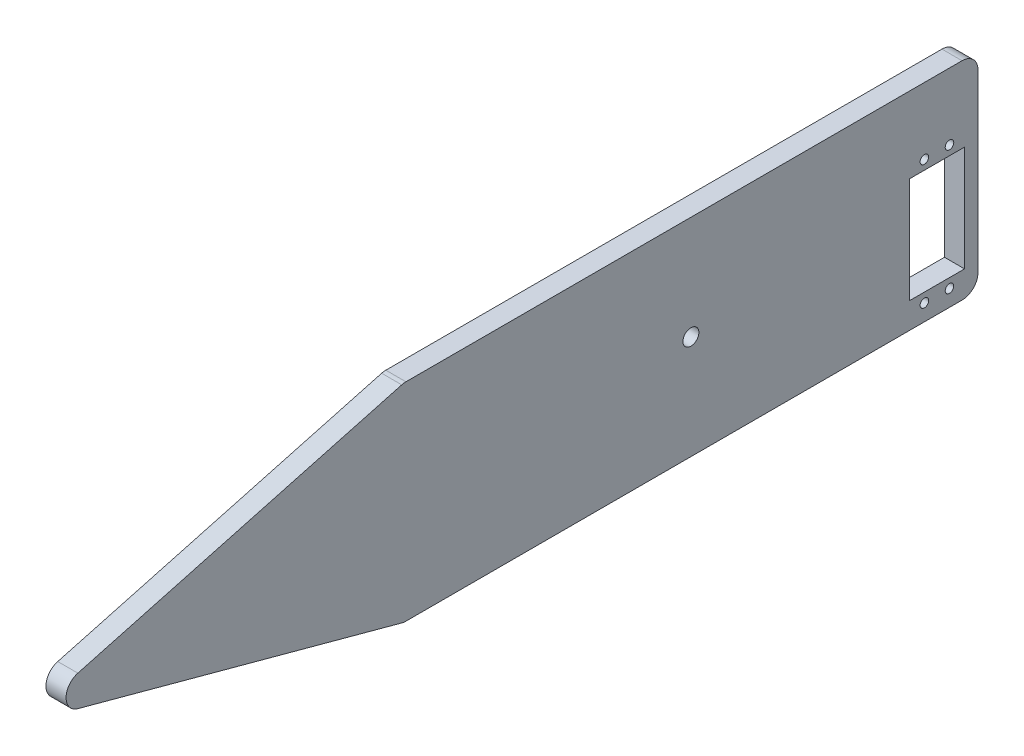
ISO-10303-21;
HEADER;
FILE_DESCRIPTION(('STEP AP214'),'2;1');
FILE_NAME('part.step','',(''),(''),'','','');
FILE_SCHEMA(('AUTOMOTIVE_DESIGN { 1 0 10303 214 1 1 1 1 }'));
ENDSEC;
DATA;
#1=APPLICATION_CONTEXT('core data for automotive mechanical design processes');
#2=APPLICATION_PROTOCOL_DEFINITION('international standard','automotive_design',2000,#1);
#3=PRODUCT_CONTEXT('',#1,'mechanical');
#4=PRODUCT('Part','Part','',(#3));
#5=PRODUCT_RELATED_PRODUCT_CATEGORY('part','',(#4));
#6=PRODUCT_DEFINITION_FORMATION('','',#4);
#7=PRODUCT_DEFINITION_CONTEXT('part definition',#1,'design');
#8=PRODUCT_DEFINITION('design','',#6,#7);
#9=PRODUCT_DEFINITION_SHAPE('','',#8);
#10=(LENGTH_UNIT() NAMED_UNIT(*) SI_UNIT(.MILLI.,.METRE.));
#11=(NAMED_UNIT(*) PLANE_ANGLE_UNIT() SI_UNIT($,.RADIAN.));
#12=(NAMED_UNIT(*) SI_UNIT($,.STERADIAN.) SOLID_ANGLE_UNIT());
#13=UNCERTAINTY_MEASURE_WITH_UNIT(LENGTH_MEASURE(1.E-05),#10,'distance_accuracy_value','');
#14=(GEOMETRIC_REPRESENTATION_CONTEXT(3) GLOBAL_UNCERTAINTY_ASSIGNED_CONTEXT((#13)) GLOBAL_UNIT_ASSIGNED_CONTEXT((#10,
#11,#12)) REPRESENTATION_CONTEXT('',''));
#15=CARTESIAN_POINT('',(0.,0.,0.));
#16=DIRECTION('',(0.,0.,1.));
#17=DIRECTION('',(1.,0.,0.));
#18=AXIS2_PLACEMENT_3D('',#15,#16,#17);
#19=CARTESIAN_POINT('',(4.0005,0.,0.));
#20=DIRECTION('',(1.,0.,0.));
#21=DIRECTION('',(0.,0.,-1.));
#22=AXIS2_PLACEMENT_3D('',#19,#20,#21);
#23=PLANE('',#22);
#24=DIRECTION('',(0.,1.,0.));
#25=VECTOR('',#24,1.);
#26=CARTESIAN_POINT('',(4.0005,-31.,-108.95));
#27=LINE('',#26,#25);
#28=CARTESIAN_POINT('',(4.0005,-31.,-108.95));
#29=VERTEX_POINT('',#28);
#30=CARTESIAN_POINT('',(4.0005,11.,-108.95));
#31=VERTEX_POINT('',#30);
#32=EDGE_CURVE('E53',#29,#31,#27,.T.);
#33=ORIENTED_EDGE('',*,*,#32,.F.);
#34=DIRECTION('',(0.,0.,-1.));
#35=VECTOR('',#34,1.);
#36=CARTESIAN_POINT('',(4.0005,-31.,-86.95));
#37=LINE('',#36,#35);
#38=CARTESIAN_POINT('',(4.0005,-31.,-86.95));
#39=VERTEX_POINT('',#38);
#40=EDGE_CURVE('E160',#39,#29,#37,.T.);
#41=ORIENTED_EDGE('',*,*,#40,.F.);
#42=DIRECTION('',(0.,-1.,0.));
#43=VECTOR('',#42,1.);
#44=CARTESIAN_POINT('',(4.0005,11.,-86.95));
#45=LINE('',#44,#43);
#46=CARTESIAN_POINT('',(4.0005,11.,-86.95));
#47=VERTEX_POINT('',#46);
#48=EDGE_CURVE('E159',#47,#39,#45,.T.);
#49=ORIENTED_EDGE('',*,*,#48,.F.);
#50=DIRECTION('',(0.,0.,1.));
#51=VECTOR('',#50,1.);
#52=CARTESIAN_POINT('',(4.0005,11.,-108.95));
#53=LINE('',#52,#51);
#54=EDGE_CURVE('E167',#31,#47,#53,.T.);
#55=ORIENTED_EDGE('',*,*,#54,.F.);
#56=EDGE_LOOP('',(#33,#41,#49,#55));
#57=FACE_BOUND('',#56,.T.);
#58=CARTESIAN_POINT('',(4.0005,-34.75,-102.95));
#59=DIRECTION('',(1.,0.,0.));
#60=DIRECTION('',(0.,0.,-1.));
#61=AXIS2_PLACEMENT_3D('',#58,#59,#60);
#62=CIRCLE('',#61,1.7);
#63=CARTESIAN_POINT('',(4.0005,-34.75,-104.65));
#64=VERTEX_POINT('',#63);
#65=EDGE_CURVE('E185',#64,#64,#62,.T.);
#66=ORIENTED_EDGE('',*,*,#65,.F.);
#67=EDGE_LOOP('',(#66));
#68=FACE_BOUND('',#67,.T.);
#69=CARTESIAN_POINT('',(4.0005,14.75,-92.95));
#70=DIRECTION('',(1.,0.,0.));
#71=DIRECTION('',(0.,0.,-1.));
#72=AXIS2_PLACEMENT_3D('',#69,#70,#71);
#73=CIRCLE('',#72,1.7);
#74=CARTESIAN_POINT('',(4.0005,14.75,-94.65));
#75=VERTEX_POINT('',#74);
#76=EDGE_CURVE('E188',#75,#75,#73,.T.);
#77=ORIENTED_EDGE('',*,*,#76,.F.);
#78=EDGE_LOOP('',(#77));
#79=FACE_BOUND('',#78,.T.);
#80=CARTESIAN_POINT('',(4.0005,14.75,-102.95));
#81=DIRECTION('',(1.,0.,0.));
#82=DIRECTION('',(0.,0.,-1.));
#83=AXIS2_PLACEMENT_3D('',#80,#81,#82);
#84=CIRCLE('',#83,1.7);
#85=CARTESIAN_POINT('',(4.0005,14.75,-104.65));
#86=VERTEX_POINT('',#85);
#87=EDGE_CURVE('E177',#86,#86,#84,.T.);
#88=ORIENTED_EDGE('',*,*,#87,.F.);
#89=EDGE_LOOP('',(#88));
#90=FACE_BOUND('',#89,.T.);
#91=CARTESIAN_POINT('',(4.0005,-34.75,-92.95));
#92=DIRECTION('',(1.,0.,0.));
#93=DIRECTION('',(0.,0.,-1.));
#94=AXIS2_PLACEMENT_3D('',#91,#92,#93);
#95=CIRCLE('',#94,1.7);
#96=CARTESIAN_POINT('',(4.0005,-34.75,-94.65));
#97=VERTEX_POINT('',#96);
#98=EDGE_CURVE('E183',#97,#97,#95,.T.);
#99=ORIENTED_EDGE('',*,*,#98,.F.);
#100=EDGE_LOOP('',(#99));
#101=FACE_BOUND('',#100,.T.);
#102=DIRECTION('',(0.,1.,0.));
#103=VECTOR('',#102,1.);
#104=CARTESIAN_POINT('',(4.0005,-41.275,-114.3));
#105=LINE('',#104,#103);
#106=CARTESIAN_POINT('',(4.0005,-34.925,-114.3));
#107=VERTEX_POINT('',#106);
#108=CARTESIAN_POINT('',(4.0005,34.925,-114.3));
#109=VERTEX_POINT('',#108);
#110=EDGE_CURVE('E213',#107,#109,#105,.T.);
#111=ORIENTED_EDGE('',*,*,#110,.T.);
#112=CARTESIAN_POINT('',(4.0005,34.925,-107.95));
#113=DIRECTION('',(1.,0.,0.));
#114=DIRECTION('',(0.,0.,-1.));
#115=AXIS2_PLACEMENT_3D('',#112,#113,#114);
#116=CIRCLE('',#115,6.35);
#117=CARTESIAN_POINT('',(4.0005,41.275,-107.95));
#118=VERTEX_POINT('',#117);
#119=EDGE_CURVE('E263',#109,#118,#116,.T.);
#120=ORIENTED_EDGE('',*,*,#119,.T.);
#121=DIRECTION('',(0.,0.,1.));
#122=VECTOR('',#121,1.);
#123=CARTESIAN_POINT('',(4.0005,41.275,-114.3));
#124=LINE('',#123,#122);
#125=CARTESIAN_POINT('',(4.0005,41.275,113.455319562879));
#126=VERTEX_POINT('',#125);
#127=EDGE_CURVE('E216',#118,#126,#124,.T.);
#128=ORIENTED_EDGE('',*,*,#127,.T.);
#129=CARTESIAN_POINT('',(4.0005,34.925,113.455319562879));
#130=DIRECTION('',(1.,0.,0.));
#131=DIRECTION('',(0.,0.,-1.));
#132=AXIS2_PLACEMENT_3D('',#129,#130,#131);
#133=CIRCLE('',#132,6.35);
#134=CARTESIAN_POINT('',(4.0005,41.0541874616917,115.115307833754));
#135=VERTEX_POINT('',#134);
#136=EDGE_CURVE('E254',#126,#135,#133,.T.);
#137=ORIENTED_EDGE('',*,*,#136,.T.);
#138=DIRECTION('',(0.,-0.261415475728318,0.965226371919944));
#139=VECTOR('',#138,1.);
#140=CARTESIAN_POINT('',(4.0005,41.275,114.3));
#141=LINE('',#140,#139);
#142=CARTESIAN_POINT('',(4.0005,6.12918746169166,244.0691539876));
#143=VERTEX_POINT('',#142);
#144=EDGE_CURVE('E218',#135,#143,#141,.T.);
#145=ORIENTED_EDGE('',*,*,#144,.T.);
#146=CARTESIAN_POINT('',(4.0005,0.,242.409165716725));
#147=DIRECTION('',(1.,0.,0.));
#148=DIRECTION('',(0.,0.,-1.));
#149=AXIS2_PLACEMENT_3D('',#146,#147,#148);
#150=CIRCLE('',#149,6.35);
#151=CARTESIAN_POINT('',(4.0005,-6.12918746169163,244.0691539876));
#152=VERTEX_POINT('',#151);
#153=EDGE_CURVE('E259',#143,#152,#150,.T.);
#154=ORIENTED_EDGE('',*,*,#153,.T.);
#155=DIRECTION('',(0.,-0.261415475728318,-0.965226371919944));
#156=VECTOR('',#155,1.);
#157=CARTESIAN_POINT('',(4.0005,0.,266.7));
#158=LINE('',#157,#156);
#159=CARTESIAN_POINT('',(4.0005,-41.0541874616916,115.115307833754));
#160=VERTEX_POINT('',#159);
#161=EDGE_CURVE('E206',#152,#160,#158,.T.);
#162=ORIENTED_EDGE('',*,*,#161,.T.);
#163=CARTESIAN_POINT('',(4.0005,-34.925,113.455319562879));
#164=DIRECTION('',(1.,0.,0.));
#165=DIRECTION('',(0.,0.,-1.));
#166=AXIS2_PLACEMENT_3D('',#163,#164,#165);
#167=CIRCLE('',#166,6.35);
#168=CARTESIAN_POINT('',(4.0005,-41.275,113.455319562879));
#169=VERTEX_POINT('',#168);
#170=EDGE_CURVE('E260',#160,#169,#167,.T.);
#171=ORIENTED_EDGE('',*,*,#170,.T.);
#172=DIRECTION('',(0.,0.,-1.));
#173=VECTOR('',#172,1.);
#174=CARTESIAN_POINT('',(4.0005,-41.275,114.3));
#175=LINE('',#174,#173);
#176=CARTESIAN_POINT('',(4.0005,-41.275,-107.95));
#177=VERTEX_POINT('',#176);
#178=EDGE_CURVE('E207',#169,#177,#175,.T.);
#179=ORIENTED_EDGE('',*,*,#178,.T.);
#180=CARTESIAN_POINT('',(4.0005,-34.925,-107.95));
#181=DIRECTION('',(1.,0.,0.));
#182=DIRECTION('',(0.,0.,-1.));
#183=AXIS2_PLACEMENT_3D('',#180,#181,#182);
#184=CIRCLE('',#183,6.35);
#185=EDGE_CURVE('E261',#177,#107,#184,.T.);
#186=ORIENTED_EDGE('',*,*,#185,.T.);
#187=EDGE_LOOP('',(#111,#120,#128,#137,#145,#154,#162,#171,#179,#186));
#188=FACE_BOUND('',#187,.T.);
#189=CARTESIAN_POINT('',(4.0005,0.,0.));
#190=DIRECTION('',(1.,0.,0.));
#191=DIRECTION('',(0.,0.,-1.));
#192=AXIS2_PLACEMENT_3D('',#189,#190,#191);
#193=CIRCLE('',#192,3.175);
#194=CARTESIAN_POINT('',(4.0005,0.,-3.175));
#195=VERTEX_POINT('',#194);
#196=EDGE_CURVE('E199',#195,#195,#193,.T.);
#197=ORIENTED_EDGE('',*,*,#196,.F.);
#198=EDGE_LOOP('',(#197));
#199=FACE_BOUND('',#198,.T.);
#200=ADVANCED_FACE('F39',(#57,#68,#79,#90,#101,#188,#199),#23,.T.);
#201=CARTESIAN_POINT('',(-4.0005,0.,0.));
#202=DIRECTION('',(1.,0.,0.));
#203=DIRECTION('',(0.,0.,-1.));
#204=AXIS2_PLACEMENT_3D('',#201,#202,#203);
#205=PLANE('',#204);
#206=DIRECTION('',(0.,0.,-1.));
#207=VECTOR('',#206,1.);
#208=CARTESIAN_POINT('',(-4.0005,-31.,-86.95));
#209=LINE('',#208,#207);
#210=CARTESIAN_POINT('',(-4.0005,-31.,-86.95));
#211=VERTEX_POINT('',#210);
#212=CARTESIAN_POINT('',(-4.0005,-31.,-108.95));
#213=VERTEX_POINT('',#212);
#214=EDGE_CURVE('E150',#211,#213,#209,.T.);
#215=ORIENTED_EDGE('',*,*,#214,.T.);
#216=DIRECTION('',(0.,1.,0.));
#217=VECTOR('',#216,1.);
#218=CARTESIAN_POINT('',(-4.0005,-31.,-108.95));
#219=LINE('',#218,#217);
#220=CARTESIAN_POINT('',(-4.0005,11.,-108.95));
#221=VERTEX_POINT('',#220);
#222=EDGE_CURVE('E143',#213,#221,#219,.T.);
#223=ORIENTED_EDGE('',*,*,#222,.T.);
#224=DIRECTION('',(0.,0.,1.));
#225=VECTOR('',#224,1.);
#226=CARTESIAN_POINT('',(-4.0005,11.,-108.95));
#227=LINE('',#226,#225);
#228=CARTESIAN_POINT('',(-4.0005,11.,-86.95));
#229=VERTEX_POINT('',#228);
#230=EDGE_CURVE('E147',#221,#229,#227,.T.);
#231=ORIENTED_EDGE('',*,*,#230,.T.);
#232=DIRECTION('',(0.,-1.,0.));
#233=VECTOR('',#232,1.);
#234=CARTESIAN_POINT('',(-4.0005,11.,-86.95));
#235=LINE('',#234,#233);
#236=EDGE_CURVE('E62',#229,#211,#235,.T.);
#237=ORIENTED_EDGE('',*,*,#236,.T.);
#238=EDGE_LOOP('',(#215,#223,#231,#237));
#239=FACE_BOUND('',#238,.T.);
#240=CARTESIAN_POINT('',(-4.0005,-34.75,-102.95));
#241=DIRECTION('',(1.,0.,0.));
#242=DIRECTION('',(0.,0.,-1.));
#243=AXIS2_PLACEMENT_3D('',#240,#241,#242);
#244=CIRCLE('',#243,1.7);
#245=CARTESIAN_POINT('',(-4.0005,-34.75,-104.65));
#246=VERTEX_POINT('',#245);
#247=EDGE_CURVE('E186',#246,#246,#244,.T.);
#248=ORIENTED_EDGE('',*,*,#247,.T.);
#249=EDGE_LOOP('',(#248));
#250=FACE_BOUND('',#249,.T.);
#251=CARTESIAN_POINT('',(-4.0005,14.75,-92.95));
#252=DIRECTION('',(1.,0.,0.));
#253=DIRECTION('',(0.,0.,-1.));
#254=AXIS2_PLACEMENT_3D('',#251,#252,#253);
#255=CIRCLE('',#254,1.7);
#256=CARTESIAN_POINT('',(-4.0005,14.75,-94.65));
#257=VERTEX_POINT('',#256);
#258=EDGE_CURVE('E179',#257,#257,#255,.T.);
#259=ORIENTED_EDGE('',*,*,#258,.T.);
#260=EDGE_LOOP('',(#259));
#261=FACE_BOUND('',#260,.T.);
#262=CARTESIAN_POINT('',(-4.0005,14.75,-102.95));
#263=DIRECTION('',(1.,0.,0.));
#264=DIRECTION('',(0.,0.,-1.));
#265=AXIS2_PLACEMENT_3D('',#262,#263,#264);
#266=CIRCLE('',#265,1.7);
#267=CARTESIAN_POINT('',(-4.0005,14.75,-104.65));
#268=VERTEX_POINT('',#267);
#269=EDGE_CURVE('E172',#268,#268,#266,.T.);
#270=ORIENTED_EDGE('',*,*,#269,.T.);
#271=EDGE_LOOP('',(#270));
#272=FACE_BOUND('',#271,.T.);
#273=CARTESIAN_POINT('',(-4.0005,-34.75,-92.95));
#274=DIRECTION('',(1.,0.,0.));
#275=DIRECTION('',(0.,0.,-1.));
#276=AXIS2_PLACEMENT_3D('',#273,#274,#275);
#277=CIRCLE('',#276,1.7);
#278=CARTESIAN_POINT('',(-4.0005,-34.75,-94.65));
#279=VERTEX_POINT('',#278);
#280=EDGE_CURVE('E194',#279,#279,#277,.T.);
#281=ORIENTED_EDGE('',*,*,#280,.T.);
#282=EDGE_LOOP('',(#281));
#283=FACE_BOUND('',#282,.T.);
#284=DIRECTION('',(0.,0.,1.));
#285=VECTOR('',#284,1.);
#286=CARTESIAN_POINT('',(-4.0005,41.275,-114.3));
#287=LINE('',#286,#285);
#288=CARTESIAN_POINT('',(-4.0005,41.275,-107.95));
#289=VERTEX_POINT('',#288);
#290=CARTESIAN_POINT('',(-4.0005,41.275,113.455319562879));
#291=VERTEX_POINT('',#290);
#292=EDGE_CURVE('E232',#289,#291,#287,.T.);
#293=ORIENTED_EDGE('',*,*,#292,.F.);
#294=CARTESIAN_POINT('',(-4.0005,34.925,-107.95));
#295=DIRECTION('',(1.,0.,0.));
#296=DIRECTION('',(0.,0.,-1.));
#297=AXIS2_PLACEMENT_3D('',#294,#295,#296);
#298=CIRCLE('',#297,6.35);
#299=CARTESIAN_POINT('',(-4.0005,34.925,-114.3));
#300=VERTEX_POINT('',#299);
#301=EDGE_CURVE('E248',#289,#300,#298,.F.);
#302=ORIENTED_EDGE('',*,*,#301,.T.);
#303=DIRECTION('',(0.,1.,0.));
#304=VECTOR('',#303,1.);
#305=CARTESIAN_POINT('',(-4.0005,-41.275,-114.3));
#306=LINE('',#305,#304);
#307=CARTESIAN_POINT('',(-4.0005,-34.925,-114.3));
#308=VERTEX_POINT('',#307);
#309=EDGE_CURVE('E229',#308,#300,#306,.T.);
#310=ORIENTED_EDGE('',*,*,#309,.F.);
#311=CARTESIAN_POINT('',(-4.0005,-34.925,-107.95));
#312=DIRECTION('',(1.,0.,0.));
#313=DIRECTION('',(0.,0.,-1.));
#314=AXIS2_PLACEMENT_3D('',#311,#312,#313);
#315=CIRCLE('',#314,6.35);
#316=CARTESIAN_POINT('',(-4.0005,-41.275,-107.95));
#317=VERTEX_POINT('',#316);
#318=EDGE_CURVE('E247',#308,#317,#315,.F.);
#319=ORIENTED_EDGE('',*,*,#318,.T.);
#320=DIRECTION('',(0.,0.,-1.));
#321=VECTOR('',#320,1.);
#322=CARTESIAN_POINT('',(-4.0005,-41.275,114.3));
#323=LINE('',#322,#321);
#324=CARTESIAN_POINT('',(-4.0005,-41.275,113.455319562879));
#325=VERTEX_POINT('',#324);
#326=EDGE_CURVE('E223',#325,#317,#323,.T.);
#327=ORIENTED_EDGE('',*,*,#326,.F.);
#328=CARTESIAN_POINT('',(-4.0005,-34.925,113.455319562879));
#329=DIRECTION('',(1.,0.,0.));
#330=DIRECTION('',(0.,0.,-1.));
#331=AXIS2_PLACEMENT_3D('',#328,#329,#330);
#332=CIRCLE('',#331,6.35);
#333=CARTESIAN_POINT('',(-4.0005,-41.0541874616916,115.115307833754));
#334=VERTEX_POINT('',#333);
#335=EDGE_CURVE('E242',#325,#334,#332,.F.);
#336=ORIENTED_EDGE('',*,*,#335,.T.);
#337=DIRECTION('',(0.,-0.261415475728318,-0.965226371919944));
#338=VECTOR('',#337,1.);
#339=CARTESIAN_POINT('',(-4.0005,0.,266.7));
#340=LINE('',#339,#338);
#341=CARTESIAN_POINT('',(-4.0005,-6.12918746169163,244.0691539876));
#342=VERTEX_POINT('',#341);
#343=EDGE_CURVE('E201',#342,#334,#340,.T.);
#344=ORIENTED_EDGE('',*,*,#343,.F.);
#345=CARTESIAN_POINT('',(-4.0005,0.,242.409165716725));
#346=DIRECTION('',(1.,0.,0.));
#347=DIRECTION('',(0.,0.,-1.));
#348=AXIS2_PLACEMENT_3D('',#345,#346,#347);
#349=CIRCLE('',#348,6.35);
#350=CARTESIAN_POINT('',(-4.0005,6.12918746169166,244.0691539876));
#351=VERTEX_POINT('',#350);
#352=EDGE_CURVE('E243',#342,#351,#349,.F.);
#353=ORIENTED_EDGE('',*,*,#352,.T.);
#354=DIRECTION('',(0.,-0.261415475728318,0.965226371919944));
#355=VECTOR('',#354,1.);
#356=CARTESIAN_POINT('',(-4.0005,41.275,114.3));
#357=LINE('',#356,#355);
#358=CARTESIAN_POINT('',(-4.0005,41.0541874616917,115.115307833754));
#359=VERTEX_POINT('',#358);
#360=EDGE_CURVE('E209',#359,#351,#357,.T.);
#361=ORIENTED_EDGE('',*,*,#360,.F.);
#362=CARTESIAN_POINT('',(-4.0005,34.925,113.455319562879));
#363=DIRECTION('',(1.,0.,0.));
#364=DIRECTION('',(0.,0.,-1.));
#365=AXIS2_PLACEMENT_3D('',#362,#363,#364);
#366=CIRCLE('',#365,6.35);
#367=EDGE_CURVE('E238',#359,#291,#366,.F.);
#368=ORIENTED_EDGE('',*,*,#367,.T.);
#369=EDGE_LOOP('',(#293,#302,#310,#319,#327,#336,#344,#353,#361,#368));
#370=FACE_BOUND('',#369,.T.);
#371=CARTESIAN_POINT('',(-4.0005,0.,0.));
#372=DIRECTION('',(1.,0.,0.));
#373=DIRECTION('',(0.,0.,-1.));
#374=AXIS2_PLACEMENT_3D('',#371,#372,#373);
#375=CIRCLE('',#374,3.175);
#376=CARTESIAN_POINT('',(-4.0005,0.,-3.175));
#377=VERTEX_POINT('',#376);
#378=EDGE_CURVE('E197',#377,#377,#375,.T.);
#379=ORIENTED_EDGE('',*,*,#378,.T.);
#380=EDGE_LOOP('',(#379));
#381=FACE_BOUND('',#380,.T.);
#382=ADVANCED_FACE('F152',(#239,#250,#261,#272,#283,#370,#381),#205,.F.);
#383=CARTESIAN_POINT('',(4.0005,0.,266.7));
#384=DIRECTION('',(0.,0.965226371919944,-0.261415475728318));
#385=DIRECTION('',(0.,0.261415475728318,0.965226371919944));
#386=AXIS2_PLACEMENT_3D('',#383,#384,#385);
#387=PLANE('',#386);
#388=ORIENTED_EDGE('',*,*,#161,.F.);
#389=DIRECTION('',(-1.,0.,0.));
#390=VECTOR('',#389,1.);
#391=CARTESIAN_POINT('',(4.0005,-6.12918746169163,244.0691539876));
#392=LINE('',#391,#390);
#393=EDGE_CURVE('E275',#152,#342,#392,.T.);
#394=ORIENTED_EDGE('',*,*,#393,.T.);
#395=ORIENTED_EDGE('',*,*,#343,.T.);
#396=DIRECTION('',(-1.,0.,0.));
#397=VECTOR('',#396,1.);
#398=CARTESIAN_POINT('',(4.0005,-41.0541874616916,115.115307833754));
#399=LINE('',#398,#397);
#400=EDGE_CURVE('E269',#334,#160,#399,.F.);
#401=ORIENTED_EDGE('',*,*,#400,.T.);
#402=EDGE_LOOP('',(#388,#394,#395,#401));
#403=FACE_BOUND('',#402,.T.);
#404=ADVANCED_FACE('F291',(#403),#387,.F.);
#405=CARTESIAN_POINT('',(4.0005,-41.275,114.3));
#406=DIRECTION('',(0.,1.,0.));
#407=DIRECTION('',(0.,0.,1.));
#408=AXIS2_PLACEMENT_3D('',#405,#406,#407);
#409=PLANE('',#408);
#410=ORIENTED_EDGE('',*,*,#326,.T.);
#411=DIRECTION('',(-1.,0.,0.));
#412=VECTOR('',#411,1.);
#413=CARTESIAN_POINT('',(4.0005,-41.275,-107.95));
#414=LINE('',#413,#412);
#415=EDGE_CURVE('E268',#317,#177,#414,.F.);
#416=ORIENTED_EDGE('',*,*,#415,.T.);
#417=ORIENTED_EDGE('',*,*,#178,.F.);
#418=DIRECTION('',(-1.,0.,0.));
#419=VECTOR('',#418,1.);
#420=CARTESIAN_POINT('',(4.0005,-41.275,113.455319562879));
#421=LINE('',#420,#419);
#422=EDGE_CURVE('E264',#169,#325,#421,.T.);
#423=ORIENTED_EDGE('',*,*,#422,.T.);
#424=EDGE_LOOP('',(#410,#416,#417,#423));
#425=FACE_BOUND('',#424,.T.);
#426=ADVANCED_FACE('F304',(#425),#409,.F.);
#427=CARTESIAN_POINT('',(4.0005,-41.275,-114.3));
#428=DIRECTION('',(0.,0.,1.));
#429=DIRECTION('',(0.,-1.,0.));
#430=AXIS2_PLACEMENT_3D('',#427,#428,#429);
#431=PLANE('',#430);
#432=ORIENTED_EDGE('',*,*,#309,.T.);
#433=DIRECTION('',(-1.,0.,0.));
#434=VECTOR('',#433,1.);
#435=CARTESIAN_POINT('',(4.0005,34.925,-114.3));
#436=LINE('',#435,#434);
#437=EDGE_CURVE('E251',#300,#109,#436,.F.);
#438=ORIENTED_EDGE('',*,*,#437,.T.);
#439=ORIENTED_EDGE('',*,*,#110,.F.);
#440=DIRECTION('',(-1.,0.,0.));
#441=VECTOR('',#440,1.);
#442=CARTESIAN_POINT('',(4.0005,-34.925,-114.3));
#443=LINE('',#442,#441);
#444=EDGE_CURVE('E246',#107,#308,#443,.T.);
#445=ORIENTED_EDGE('',*,*,#444,.T.);
#446=EDGE_LOOP('',(#432,#438,#439,#445));
#447=FACE_BOUND('',#446,.T.);
#448=ADVANCED_FACE('F311',(#447),#431,.F.);
#449=CARTESIAN_POINT('',(4.0005,41.275,-114.3));
#450=DIRECTION('',(0.,-1.,0.));
#451=DIRECTION('',(0.,0.,-1.));
#452=AXIS2_PLACEMENT_3D('',#449,#450,#451);
#453=PLANE('',#452);
#454=ORIENTED_EDGE('',*,*,#127,.F.);
#455=DIRECTION('',(-1.,0.,0.));
#456=VECTOR('',#455,1.);
#457=CARTESIAN_POINT('',(4.0005,41.275,-107.95));
#458=LINE('',#457,#456);
#459=EDGE_CURVE('E240',#118,#289,#458,.T.);
#460=ORIENTED_EDGE('',*,*,#459,.T.);
#461=ORIENTED_EDGE('',*,*,#292,.T.);
#462=DIRECTION('',(-1.,0.,0.));
#463=VECTOR('',#462,1.);
#464=CARTESIAN_POINT('',(4.0005,41.275,113.455319562879));
#465=LINE('',#464,#463);
#466=EDGE_CURVE('E225',#291,#126,#465,.F.);
#467=ORIENTED_EDGE('',*,*,#466,.T.);
#468=EDGE_LOOP('',(#454,#460,#461,#467));
#469=FACE_BOUND('',#468,.T.);
#470=ADVANCED_FACE('F321',(#469),#453,.F.);
#471=CARTESIAN_POINT('',(4.0005,41.275,114.3));
#472=DIRECTION('',(0.,-0.965226371919944,-0.261415475728318));
#473=DIRECTION('',(0.,0.261415475728318,-0.965226371919944));
#474=AXIS2_PLACEMENT_3D('',#471,#472,#473);
#475=PLANE('',#474);
#476=ORIENTED_EDGE('',*,*,#360,.T.);
#477=DIRECTION('',(-1.,0.,0.));
#478=VECTOR('',#477,1.);
#479=CARTESIAN_POINT('',(4.0005,6.12918746169167,244.0691539876));
#480=LINE('',#479,#478);
#481=EDGE_CURVE('E11',#351,#143,#480,.F.);
#482=ORIENTED_EDGE('',*,*,#481,.T.);
#483=ORIENTED_EDGE('',*,*,#144,.F.);
#484=DIRECTION('',(-1.,0.,0.));
#485=VECTOR('',#484,1.);
#486=CARTESIAN_POINT('',(4.0005,41.0541874616917,115.115307833754));
#487=LINE('',#486,#485);
#488=EDGE_CURVE('E50',#135,#359,#487,.T.);
#489=ORIENTED_EDGE('',*,*,#488,.T.);
#490=EDGE_LOOP('',(#476,#482,#483,#489));
#491=FACE_BOUND('',#490,.T.);
#492=ADVANCED_FACE('F276',(#491),#475,.F.);
#493=CARTESIAN_POINT('',(4.0005,0.,0.));
#494=DIRECTION('',(-1.,0.,0.));
#495=DIRECTION('',(0.,0.,1.));
#496=AXIS2_PLACEMENT_3D('',#493,#494,#495);
#497=CYLINDRICAL_SURFACE('',#496,3.175);
#498=ORIENTED_EDGE('',*,*,#196,.T.);
#499=EDGE_LOOP('',(#498));
#500=FACE_BOUND('',#499,.T.);
#501=ORIENTED_EDGE('',*,*,#378,.F.);
#502=EDGE_LOOP('',(#501));
#503=FACE_BOUND('',#502,.T.);
#504=ADVANCED_FACE('F345',(#500,#503),#497,.F.);
#505=CARTESIAN_POINT('',(4.0005,34.925,-107.95));
#506=DIRECTION('',(-1.,0.,0.));
#507=DIRECTION('',(0.,0.,1.));
#508=AXIS2_PLACEMENT_3D('',#505,#506,#507);
#509=CYLINDRICAL_SURFACE('',#508,6.35);
#510=ORIENTED_EDGE('',*,*,#119,.F.);
#511=ORIENTED_EDGE('',*,*,#437,.F.);
#512=ORIENTED_EDGE('',*,*,#301,.F.);
#513=ORIENTED_EDGE('',*,*,#459,.F.);
#514=EDGE_LOOP('',(#510,#511,#512,#513));
#515=FACE_BOUND('',#514,.T.);
#516=ADVANCED_FACE('F317',(#515),#509,.T.);
#517=CARTESIAN_POINT('',(4.0005,-34.925,-107.95));
#518=DIRECTION('',(-1.,0.,0.));
#519=DIRECTION('',(0.,0.,1.));
#520=AXIS2_PLACEMENT_3D('',#517,#518,#519);
#521=CYLINDRICAL_SURFACE('',#520,6.35);
#522=ORIENTED_EDGE('',*,*,#185,.F.);
#523=ORIENTED_EDGE('',*,*,#415,.F.);
#524=ORIENTED_EDGE('',*,*,#318,.F.);
#525=ORIENTED_EDGE('',*,*,#444,.F.);
#526=EDGE_LOOP('',(#522,#523,#524,#525));
#527=FACE_BOUND('',#526,.T.);
#528=ADVANCED_FACE('F309',(#527),#521,.T.);
#529=CARTESIAN_POINT('',(4.0005,0.,242.409165716725));
#530=DIRECTION('',(-1.,0.,0.));
#531=DIRECTION('',(0.,0.,1.));
#532=AXIS2_PLACEMENT_3D('',#529,#530,#531);
#533=CYLINDRICAL_SURFACE('',#532,6.35);
#534=ORIENTED_EDGE('',*,*,#153,.F.);
#535=ORIENTED_EDGE('',*,*,#481,.F.);
#536=ORIENTED_EDGE('',*,*,#352,.F.);
#537=ORIENTED_EDGE('',*,*,#393,.F.);
#538=EDGE_LOOP('',(#534,#535,#536,#537));
#539=FACE_BOUND('',#538,.T.);
#540=ADVANCED_FACE('F286',(#539),#533,.T.);
#541=CARTESIAN_POINT('',(4.0005,-34.925,113.455319562879));
#542=DIRECTION('',(-1.,0.,0.));
#543=DIRECTION('',(0.,0.,1.));
#544=AXIS2_PLACEMENT_3D('',#541,#542,#543);
#545=CYLINDRICAL_SURFACE('',#544,6.35);
#546=ORIENTED_EDGE('',*,*,#170,.F.);
#547=ORIENTED_EDGE('',*,*,#400,.F.);
#548=ORIENTED_EDGE('',*,*,#335,.F.);
#549=ORIENTED_EDGE('',*,*,#422,.F.);
#550=EDGE_LOOP('',(#546,#547,#548,#549));
#551=FACE_BOUND('',#550,.T.);
#552=ADVANCED_FACE('F302',(#551),#545,.T.);
#553=CARTESIAN_POINT('',(4.0005,34.925,113.455319562879));
#554=DIRECTION('',(-1.,0.,0.));
#555=DIRECTION('',(0.,0.,1.));
#556=AXIS2_PLACEMENT_3D('',#553,#554,#555);
#557=CYLINDRICAL_SURFACE('',#556,6.35);
#558=ORIENTED_EDGE('',*,*,#136,.F.);
#559=ORIENTED_EDGE('',*,*,#466,.F.);
#560=ORIENTED_EDGE('',*,*,#367,.F.);
#561=ORIENTED_EDGE('',*,*,#488,.F.);
#562=EDGE_LOOP('',(#558,#559,#560,#561));
#563=FACE_BOUND('',#562,.T.);
#564=ADVANCED_FACE('F41',(#563),#557,.T.);
#565=CARTESIAN_POINT('',(-4.0005,-34.75,-92.95));
#566=DIRECTION('',(1.,0.,0.));
#567=DIRECTION('',(0.,0.,-1.));
#568=AXIS2_PLACEMENT_3D('',#565,#566,#567);
#569=CYLINDRICAL_SURFACE('',#568,1.7);
#570=ORIENTED_EDGE('',*,*,#280,.F.);
#571=EDGE_LOOP('',(#570));
#572=FACE_BOUND('',#571,.T.);
#573=ORIENTED_EDGE('',*,*,#98,.T.);
#574=EDGE_LOOP('',(#573));
#575=FACE_BOUND('',#574,.T.);
#576=ADVANCED_FACE('F322',(#572,#575),#569,.F.);
#577=CARTESIAN_POINT('',(-4.0005,14.75,-102.95));
#578=DIRECTION('',(1.,0.,0.));
#579=DIRECTION('',(0.,0.,-1.));
#580=AXIS2_PLACEMENT_3D('',#577,#578,#579);
#581=CYLINDRICAL_SURFACE('',#580,1.7);
#582=ORIENTED_EDGE('',*,*,#269,.F.);
#583=EDGE_LOOP('',(#582));
#584=FACE_BOUND('',#583,.T.);
#585=ORIENTED_EDGE('',*,*,#87,.T.);
#586=EDGE_LOOP('',(#585));
#587=FACE_BOUND('',#586,.T.);
#588=ADVANCED_FACE('F328',(#584,#587),#581,.F.);
#589=CARTESIAN_POINT('',(-4.0005,14.75,-92.95));
#590=DIRECTION('',(1.,0.,0.));
#591=DIRECTION('',(0.,0.,-1.));
#592=AXIS2_PLACEMENT_3D('',#589,#590,#591);
#593=CYLINDRICAL_SURFACE('',#592,1.7);
#594=ORIENTED_EDGE('',*,*,#258,.F.);
#595=EDGE_LOOP('',(#594));
#596=FACE_BOUND('',#595,.T.);
#597=ORIENTED_EDGE('',*,*,#76,.T.);
#598=EDGE_LOOP('',(#597));
#599=FACE_BOUND('',#598,.T.);
#600=ADVANCED_FACE('F389',(#596,#599),#593,.F.);
#601=CARTESIAN_POINT('',(-4.0005,-34.75,-102.95));
#602=DIRECTION('',(1.,0.,0.));
#603=DIRECTION('',(0.,0.,-1.));
#604=AXIS2_PLACEMENT_3D('',#601,#602,#603);
#605=CYLINDRICAL_SURFACE('',#604,1.7);
#606=ORIENTED_EDGE('',*,*,#247,.F.);
#607=EDGE_LOOP('',(#606));
#608=FACE_BOUND('',#607,.T.);
#609=ORIENTED_EDGE('',*,*,#65,.T.);
#610=EDGE_LOOP('',(#609));
#611=FACE_BOUND('',#610,.T.);
#612=ADVANCED_FACE('F398',(#608,#611),#605,.F.);
#613=CARTESIAN_POINT('',(-4.0005,-31.,-108.95));
#614=DIRECTION('',(0.,0.,-1.));
#615=DIRECTION('',(-1.,0.,0.));
#616=AXIS2_PLACEMENT_3D('',#613,#614,#615);
#617=PLANE('',#616);
#618=ORIENTED_EDGE('',*,*,#32,.T.);
#619=DIRECTION('',(1.,0.,0.));
#620=VECTOR('',#619,1.);
#621=CARTESIAN_POINT('',(-4.0005,11.,-108.95));
#622=LINE('',#621,#620);
#623=EDGE_CURVE('E140',#221,#31,#622,.T.);
#624=ORIENTED_EDGE('',*,*,#623,.F.);
#625=ORIENTED_EDGE('',*,*,#222,.F.);
#626=DIRECTION('',(1.,0.,0.));
#627=VECTOR('',#626,1.);
#628=CARTESIAN_POINT('',(-4.0005,-31.,-108.95));
#629=LINE('',#628,#627);
#630=EDGE_CURVE('E168',#213,#29,#629,.T.);
#631=ORIENTED_EDGE('',*,*,#630,.T.);
#632=EDGE_LOOP('',(#618,#624,#625,#631));
#633=FACE_BOUND('',#632,.T.);
#634=ADVANCED_FACE('F139',(#633),#617,.F.);
#635=CARTESIAN_POINT('',(-4.0005,-31.,-86.95));
#636=DIRECTION('',(0.,-1.,0.));
#637=DIRECTION('',(0.,0.,-1.));
#638=AXIS2_PLACEMENT_3D('',#635,#636,#637);
#639=PLANE('',#638);
#640=ORIENTED_EDGE('',*,*,#40,.T.);
#641=ORIENTED_EDGE('',*,*,#630,.F.);
#642=ORIENTED_EDGE('',*,*,#214,.F.);
#643=DIRECTION('',(1.,0.,0.));
#644=VECTOR('',#643,1.);
#645=CARTESIAN_POINT('',(-4.0005,-31.,-86.95));
#646=LINE('',#645,#644);
#647=EDGE_CURVE('E174',#211,#39,#646,.T.);
#648=ORIENTED_EDGE('',*,*,#647,.T.);
#649=EDGE_LOOP('',(#640,#641,#642,#648));
#650=FACE_BOUND('',#649,.T.);
#651=ADVANCED_FACE('F418',(#650),#639,.F.);
#652=CARTESIAN_POINT('',(-4.0005,11.,-86.95));
#653=DIRECTION('',(0.,0.,1.));
#654=DIRECTION('',(1.,0.,0.));
#655=AXIS2_PLACEMENT_3D('',#652,#653,#654);
#656=PLANE('',#655);
#657=ORIENTED_EDGE('',*,*,#48,.T.);
#658=ORIENTED_EDGE('',*,*,#647,.F.);
#659=ORIENTED_EDGE('',*,*,#236,.F.);
#660=DIRECTION('',(1.,0.,0.));
#661=VECTOR('',#660,1.);
#662=CARTESIAN_POINT('',(-4.0005,11.,-86.95));
#663=LINE('',#662,#661);
#664=EDGE_CURVE('E148',#229,#47,#663,.T.);
#665=ORIENTED_EDGE('',*,*,#664,.T.);
#666=EDGE_LOOP('',(#657,#658,#659,#665));
#667=FACE_BOUND('',#666,.T.);
#668=ADVANCED_FACE('F422',(#667),#656,.F.);
#669=CARTESIAN_POINT('',(-4.0005,11.,-108.95));
#670=DIRECTION('',(0.,1.,0.));
#671=DIRECTION('',(0.,0.,1.));
#672=AXIS2_PLACEMENT_3D('',#669,#670,#671);
#673=PLANE('',#672);
#674=ORIENTED_EDGE('',*,*,#54,.T.);
#675=ORIENTED_EDGE('',*,*,#664,.F.);
#676=ORIENTED_EDGE('',*,*,#230,.F.);
#677=ORIENTED_EDGE('',*,*,#623,.T.);
#678=EDGE_LOOP('',(#674,#675,#676,#677));
#679=FACE_BOUND('',#678,.T.);
#680=ADVANCED_FACE('F151',(#679),#673,.F.);
#681=CLOSED_SHELL('',(#200,#382,#404,#426,#448,#470,#492,#504,#516,#528,#540,#552,#564,#576,
#588,#600,#612,#634,#651,#668,#680));
#682=MANIFOLD_SOLID_BREP('B2',#681);
#683=ADVANCED_BREP_SHAPE_REPRESENTATION('',(#18,#682),#14);
#684=SHAPE_DEFINITION_REPRESENTATION(#9,#683);
ENDSEC;
END-ISO-10303-21;
